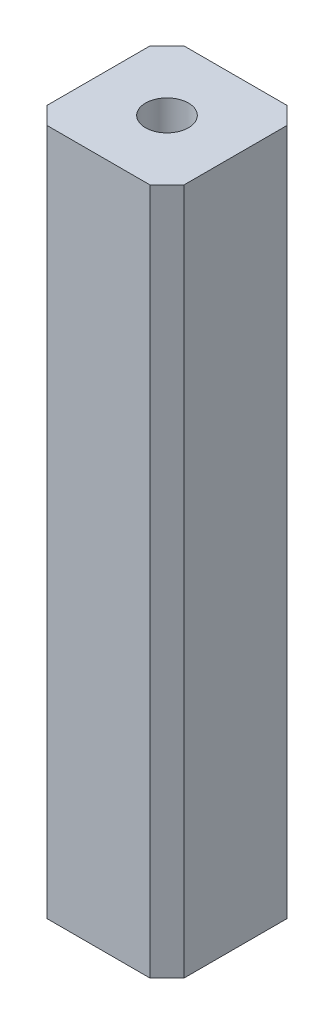
ISO-10303-21;
HEADER;
FILE_DESCRIPTION(('STEP AP214'),'2;1');
FILE_NAME('part.step','',(''),(''),'','','');
FILE_SCHEMA(('AUTOMOTIVE_DESIGN { 1 0 10303 214 1 1 1 1 }'));
ENDSEC;
DATA;
#1=APPLICATION_CONTEXT('core data for automotive mechanical design processes');
#2=APPLICATION_PROTOCOL_DEFINITION('international standard','automotive_design',2000,#1);
#3=PRODUCT_CONTEXT('',#1,'mechanical');
#4=PRODUCT('Part','Part','',(#3));
#5=PRODUCT_RELATED_PRODUCT_CATEGORY('part','',(#4));
#6=PRODUCT_DEFINITION_FORMATION('','',#4);
#7=PRODUCT_DEFINITION_CONTEXT('part definition',#1,'design');
#8=PRODUCT_DEFINITION('design','',#6,#7);
#9=PRODUCT_DEFINITION_SHAPE('','',#8);
#10=(LENGTH_UNIT() NAMED_UNIT(*) SI_UNIT(.MILLI.,.METRE.));
#11=(NAMED_UNIT(*) PLANE_ANGLE_UNIT() SI_UNIT($,.RADIAN.));
#12=(NAMED_UNIT(*) SI_UNIT($,.STERADIAN.) SOLID_ANGLE_UNIT());
#13=UNCERTAINTY_MEASURE_WITH_UNIT(LENGTH_MEASURE(1.E-05),#10,'distance_accuracy_value','');
#14=(GEOMETRIC_REPRESENTATION_CONTEXT(3) GLOBAL_UNCERTAINTY_ASSIGNED_CONTEXT((#13)) GLOBAL_UNIT_ASSIGNED_CONTEXT((#10,
#11,#12)) REPRESENTATION_CONTEXT('',''));
#15=CARTESIAN_POINT('',(0.,0.,0.));
#16=DIRECTION('',(0.,0.,1.));
#17=DIRECTION('',(1.,0.,0.));
#18=AXIS2_PLACEMENT_3D('',#15,#16,#17);
#19=CARTESIAN_POINT('',(0.,40.,0.));
#20=DIRECTION('',(0.,-1.,0.));
#21=DIRECTION('',(0.,0.,-1.));
#22=AXIS2_PLACEMENT_3D('',#19,#20,#21);
#23=PLANE('',#22);
#24=DIRECTION('',(0.,0.,-1.));
#25=VECTOR('',#24,1.);
#26=CARTESIAN_POINT('',(4.,40.,4.));
#27=LINE('',#26,#25);
#28=CARTESIAN_POINT('',(4.,40.,3.));
#29=VERTEX_POINT('',#28);
#30=CARTESIAN_POINT('',(4.,40.,-2.99999999999999));
#31=VERTEX_POINT('',#30);
#32=EDGE_CURVE('E143',#29,#31,#27,.T.);
#33=ORIENTED_EDGE('',*,*,#32,.T.);
#34=DIRECTION('',(0.707106781186546,0.,0.707106781186549));
#35=VECTOR('',#34,1.);
#36=CARTESIAN_POINT('',(3.,40.,-4.));
#37=LINE('',#36,#35);
#38=CARTESIAN_POINT('',(3.,40.,-4.));
#39=VERTEX_POINT('',#38);
#40=EDGE_CURVE('E158',#31,#39,#37,.F.);
#41=ORIENTED_EDGE('',*,*,#40,.T.);
#42=DIRECTION('',(-1.,0.,0.));
#43=VECTOR('',#42,1.);
#44=CARTESIAN_POINT('',(-4.,40.,-4.));
#45=LINE('',#44,#43);
#46=CARTESIAN_POINT('',(-2.99999999999999,40.,-4.));
#47=VERTEX_POINT('',#46);
#48=EDGE_CURVE('E125',#39,#47,#45,.T.);
#49=ORIENTED_EDGE('',*,*,#48,.T.);
#50=DIRECTION('',(0.707106781186549,0.,-0.707106781186546));
#51=VECTOR('',#50,1.);
#52=CARTESIAN_POINT('',(-4.,40.,-3.));
#53=LINE('',#52,#51);
#54=CARTESIAN_POINT('',(-4.,40.,-3.));
#55=VERTEX_POINT('',#54);
#56=EDGE_CURVE('E156',#47,#55,#53,.F.);
#57=ORIENTED_EDGE('',*,*,#56,.T.);
#58=DIRECTION('',(0.,0.,1.));
#59=VECTOR('',#58,1.);
#60=CARTESIAN_POINT('',(-4.,40.,4.));
#61=LINE('',#60,#59);
#62=CARTESIAN_POINT('',(-4.,40.,2.99999999999999));
#63=VERTEX_POINT('',#62);
#64=EDGE_CURVE('E169',#55,#63,#61,.T.);
#65=ORIENTED_EDGE('',*,*,#64,.T.);
#66=DIRECTION('',(-0.707106781186546,0.,-0.707106781186549));
#67=VECTOR('',#66,1.);
#68=CARTESIAN_POINT('',(-3.,40.,4.));
#69=LINE('',#68,#67);
#70=CARTESIAN_POINT('',(-3.,40.,4.));
#71=VERTEX_POINT('',#70);
#72=EDGE_CURVE('E60',#63,#71,#69,.F.);
#73=ORIENTED_EDGE('',*,*,#72,.T.);
#74=DIRECTION('',(1.,0.,0.));
#75=VECTOR('',#74,1.);
#76=CARTESIAN_POINT('',(-4.,40.,4.));
#77=LINE('',#76,#75);
#78=CARTESIAN_POINT('',(2.99999999999999,40.,4.));
#79=VERTEX_POINT('',#78);
#80=EDGE_CURVE('E144',#71,#79,#77,.T.);
#81=ORIENTED_EDGE('',*,*,#80,.T.);
#82=DIRECTION('',(-0.707106781186549,0.,0.707106781186546));
#83=VECTOR('',#82,1.);
#84=CARTESIAN_POINT('',(4.,40.,3.));
#85=LINE('',#84,#83);
#86=EDGE_CURVE('E153',#79,#29,#85,.F.);
#87=ORIENTED_EDGE('',*,*,#86,.T.);
#88=EDGE_LOOP('',(#33,#41,#49,#57,#65,#73,#81,#87));
#89=FACE_BOUND('',#88,.T.);
#90=CARTESIAN_POINT('',(0.,40.,0.));
#91=DIRECTION('',(0.,1.,0.));
#92=DIRECTION('',(0.,0.,1.));
#93=AXIS2_PLACEMENT_3D('',#90,#91,#92);
#94=CIRCLE('',#93,1.25);
#95=CARTESIAN_POINT('',(0.,40.,1.25));
#96=VERTEX_POINT('',#95);
#97=EDGE_CURVE('E138',#96,#96,#94,.T.);
#98=ORIENTED_EDGE('',*,*,#97,.F.);
#99=EDGE_LOOP('',(#98));
#100=FACE_BOUND('',#99,.T.);
#101=ADVANCED_FACE('F39',(#89,#100),#23,.F.);
#102=CARTESIAN_POINT('',(0.,0.,0.));
#103=DIRECTION('',(0.,-1.,0.));
#104=DIRECTION('',(0.,0.,-1.));
#105=AXIS2_PLACEMENT_3D('',#102,#103,#104);
#106=PLANE('',#105);
#107=DIRECTION('',(-1.,0.,0.));
#108=VECTOR('',#107,1.);
#109=CARTESIAN_POINT('',(-4.,0.,-4.));
#110=LINE('',#109,#108);
#111=CARTESIAN_POINT('',(3.,0.,-4.));
#112=VERTEX_POINT('',#111);
#113=CARTESIAN_POINT('',(-2.99999999999999,0.,-4.));
#114=VERTEX_POINT('',#113);
#115=EDGE_CURVE('E122',#112,#114,#110,.T.);
#116=ORIENTED_EDGE('',*,*,#115,.F.);
#117=DIRECTION('',(-0.707106781186546,0.,-0.707106781186549));
#118=VECTOR('',#117,1.);
#119=CARTESIAN_POINT('',(3.5,0.,-3.49999999999999));
#120=LINE('',#119,#118);
#121=CARTESIAN_POINT('',(4.,0.,-2.99999999999999));
#122=VERTEX_POINT('',#121);
#123=EDGE_CURVE('E105',#112,#122,#120,.F.);
#124=ORIENTED_EDGE('',*,*,#123,.T.);
#125=DIRECTION('',(0.,0.,-1.));
#126=VECTOR('',#125,1.);
#127=CARTESIAN_POINT('',(4.,0.,4.));
#128=LINE('',#127,#126);
#129=CARTESIAN_POINT('',(4.,0.,3.));
#130=VERTEX_POINT('',#129);
#131=EDGE_CURVE('E133',#130,#122,#128,.T.);
#132=ORIENTED_EDGE('',*,*,#131,.F.);
#133=DIRECTION('',(0.707106781186549,0.,-0.707106781186546));
#134=VECTOR('',#133,1.);
#135=CARTESIAN_POINT('',(3.49999999999999,0.,3.5));
#136=LINE('',#135,#134);
#137=CARTESIAN_POINT('',(2.99999999999999,0.,4.));
#138=VERTEX_POINT('',#137);
#139=EDGE_CURVE('E126',#130,#138,#136,.F.);
#140=ORIENTED_EDGE('',*,*,#139,.T.);
#141=DIRECTION('',(1.,0.,0.));
#142=VECTOR('',#141,1.);
#143=CARTESIAN_POINT('',(-4.,0.,4.));
#144=LINE('',#143,#142);
#145=CARTESIAN_POINT('',(-3.,0.,4.));
#146=VERTEX_POINT('',#145);
#147=EDGE_CURVE('E136',#146,#138,#144,.T.);
#148=ORIENTED_EDGE('',*,*,#147,.F.);
#149=DIRECTION('',(0.707106781186546,0.,0.707106781186549));
#150=VECTOR('',#149,1.);
#151=CARTESIAN_POINT('',(-3.5,0.,3.49999999999999));
#152=LINE('',#151,#150);
#153=CARTESIAN_POINT('',(-4.,0.,2.99999999999999));
#154=VERTEX_POINT('',#153);
#155=EDGE_CURVE('E147',#146,#154,#152,.F.);
#156=ORIENTED_EDGE('',*,*,#155,.T.);
#157=DIRECTION('',(0.,0.,1.));
#158=VECTOR('',#157,1.);
#159=CARTESIAN_POINT('',(-4.,0.,4.));
#160=LINE('',#159,#158);
#161=CARTESIAN_POINT('',(-4.,0.,-3.));
#162=VERTEX_POINT('',#161);
#163=EDGE_CURVE('E132',#162,#154,#160,.T.);
#164=ORIENTED_EDGE('',*,*,#163,.F.);
#165=DIRECTION('',(-0.707106781186549,0.,0.707106781186546));
#166=VECTOR('',#165,1.);
#167=CARTESIAN_POINT('',(-3.49999999999999,0.,-3.5));
#168=LINE('',#167,#166);
#169=EDGE_CURVE('E116',#162,#114,#168,.F.);
#170=ORIENTED_EDGE('',*,*,#169,.T.);
#171=EDGE_LOOP('',(#116,#124,#132,#140,#148,#156,#164,#170));
#172=FACE_BOUND('',#171,.T.);
#173=CARTESIAN_POINT('',(0.,0.,0.));
#174=DIRECTION('',(0.,1.,0.));
#175=DIRECTION('',(0.,0.,1.));
#176=AXIS2_PLACEMENT_3D('',#173,#174,#175);
#177=CIRCLE('',#176,1.25);
#178=CARTESIAN_POINT('',(0.,0.,1.25));
#179=VERTEX_POINT('',#178);
#180=EDGE_CURVE('E183',#179,#179,#177,.T.);
#181=ORIENTED_EDGE('',*,*,#180,.T.);
#182=EDGE_LOOP('',(#181));
#183=FACE_BOUND('',#182,.T.);
#184=ADVANCED_FACE('F129',(#172,#183),#106,.T.);
#185=CARTESIAN_POINT('',(4.,40.,4.));
#186=DIRECTION('',(-1.,0.,0.));
#187=DIRECTION('',(0.,0.,1.));
#188=AXIS2_PLACEMENT_3D('',#185,#186,#187);
#189=PLANE('',#188);
#190=ORIENTED_EDGE('',*,*,#131,.T.);
#191=DIRECTION('',(0.,1.,0.));
#192=VECTOR('',#191,1.);
#193=CARTESIAN_POINT('',(4.,40.,-2.99999999999999));
#194=LINE('',#193,#192);
#195=EDGE_CURVE('E110',#122,#31,#194,.T.);
#196=ORIENTED_EDGE('',*,*,#195,.T.);
#197=ORIENTED_EDGE('',*,*,#32,.F.);
#198=DIRECTION('',(0.,-1.,0.));
#199=VECTOR('',#198,1.);
#200=CARTESIAN_POINT('',(4.,40.,3.));
#201=LINE('',#200,#199);
#202=EDGE_CURVE('E115',#29,#130,#201,.T.);
#203=ORIENTED_EDGE('',*,*,#202,.T.);
#204=EDGE_LOOP('',(#190,#196,#197,#203));
#205=FACE_BOUND('',#204,.T.);
#206=ADVANCED_FACE('F197',(#205),#189,.F.);
#207=CARTESIAN_POINT('',(-4.,40.,-4.));
#208=DIRECTION('',(0.,0.,1.));
#209=DIRECTION('',(1.,0.,0.));
#210=AXIS2_PLACEMENT_3D('',#207,#208,#209);
#211=PLANE('',#210);
#212=ORIENTED_EDGE('',*,*,#48,.F.);
#213=DIRECTION('',(0.,-1.,0.));
#214=VECTOR('',#213,1.);
#215=CARTESIAN_POINT('',(3.,40.,-4.));
#216=LINE('',#215,#214);
#217=EDGE_CURVE('E109',#39,#112,#216,.T.);
#218=ORIENTED_EDGE('',*,*,#217,.T.);
#219=ORIENTED_EDGE('',*,*,#115,.T.);
#220=DIRECTION('',(0.,1.,0.));
#221=VECTOR('',#220,1.);
#222=CARTESIAN_POINT('',(-2.99999999999999,40.,-4.));
#223=LINE('',#222,#221);
#224=EDGE_CURVE('E127',#114,#47,#223,.T.);
#225=ORIENTED_EDGE('',*,*,#224,.T.);
#226=EDGE_LOOP('',(#212,#218,#219,#225));
#227=FACE_BOUND('',#226,.T.);
#228=ADVANCED_FACE('F121',(#227),#211,.F.);
#229=CARTESIAN_POINT('',(-4.,40.,4.));
#230=DIRECTION('',(1.,0.,0.));
#231=DIRECTION('',(0.,0.,-1.));
#232=AXIS2_PLACEMENT_3D('',#229,#230,#231);
#233=PLANE('',#232);
#234=ORIENTED_EDGE('',*,*,#64,.F.);
#235=DIRECTION('',(0.,-1.,0.));
#236=VECTOR('',#235,1.);
#237=CARTESIAN_POINT('',(-4.,40.,-3.));
#238=LINE('',#237,#236);
#239=EDGE_CURVE('E162',#55,#162,#238,.T.);
#240=ORIENTED_EDGE('',*,*,#239,.T.);
#241=ORIENTED_EDGE('',*,*,#163,.T.);
#242=DIRECTION('',(0.,1.,0.));
#243=VECTOR('',#242,1.);
#244=CARTESIAN_POINT('',(-4.,40.,2.99999999999999));
#245=LINE('',#244,#243);
#246=EDGE_CURVE('E160',#154,#63,#245,.T.);
#247=ORIENTED_EDGE('',*,*,#246,.T.);
#248=EDGE_LOOP('',(#234,#240,#241,#247));
#249=FACE_BOUND('',#248,.T.);
#250=ADVANCED_FACE('F167',(#249),#233,.F.);
#251=CARTESIAN_POINT('',(-4.,40.,4.));
#252=DIRECTION('',(0.,0.,-1.));
#253=DIRECTION('',(-1.,0.,0.));
#254=AXIS2_PLACEMENT_3D('',#251,#252,#253);
#255=PLANE('',#254);
#256=ORIENTED_EDGE('',*,*,#80,.F.);
#257=DIRECTION('',(0.,-1.,0.));
#258=VECTOR('',#257,1.);
#259=CARTESIAN_POINT('',(-3.,40.,4.));
#260=LINE('',#259,#258);
#261=EDGE_CURVE('E11',#71,#146,#260,.T.);
#262=ORIENTED_EDGE('',*,*,#261,.T.);
#263=ORIENTED_EDGE('',*,*,#147,.T.);
#264=DIRECTION('',(0.,1.,0.));
#265=VECTOR('',#264,1.);
#266=CARTESIAN_POINT('',(2.99999999999999,40.,4.));
#267=LINE('',#266,#265);
#268=EDGE_CURVE('E47',#138,#79,#267,.T.);
#269=ORIENTED_EDGE('',*,*,#268,.T.);
#270=EDGE_LOOP('',(#256,#262,#263,#269));
#271=FACE_BOUND('',#270,.T.);
#272=ADVANCED_FACE('F176',(#271),#255,.F.);
#273=CARTESIAN_POINT('',(0.,40.,0.));
#274=DIRECTION('',(0.,-1.,0.));
#275=DIRECTION('',(0.,0.,-1.));
#276=AXIS2_PLACEMENT_3D('',#273,#274,#275);
#277=CYLINDRICAL_SURFACE('',#276,1.25);
#278=ORIENTED_EDGE('',*,*,#97,.T.);
#279=EDGE_LOOP('',(#278));
#280=FACE_BOUND('',#279,.T.);
#281=ORIENTED_EDGE('',*,*,#180,.F.);
#282=EDGE_LOOP('',(#281));
#283=FACE_BOUND('',#282,.T.);
#284=ADVANCED_FACE('F189',(#280,#283),#277,.F.);
#285=CARTESIAN_POINT('',(3.,40.,-4.));
#286=DIRECTION('',(-0.707106781186549,0.,0.707106781186546));
#287=DIRECTION('',(0.,-1.,0.));
#288=AXIS2_PLACEMENT_3D('',#285,#286,#287);
#289=PLANE('',#288);
#290=ORIENTED_EDGE('',*,*,#40,.F.);
#291=ORIENTED_EDGE('',*,*,#195,.F.);
#292=ORIENTED_EDGE('',*,*,#123,.F.);
#293=ORIENTED_EDGE('',*,*,#217,.F.);
#294=EDGE_LOOP('',(#290,#291,#292,#293));
#295=FACE_BOUND('',#294,.T.);
#296=ADVANCED_FACE('F108',(#295),#289,.F.);
#297=CARTESIAN_POINT('',(-4.,40.,-3.));
#298=DIRECTION('',(0.707106781186546,0.,0.707106781186549));
#299=DIRECTION('',(0.,-1.,0.));
#300=AXIS2_PLACEMENT_3D('',#297,#298,#299);
#301=PLANE('',#300);
#302=ORIENTED_EDGE('',*,*,#56,.F.);
#303=ORIENTED_EDGE('',*,*,#224,.F.);
#304=ORIENTED_EDGE('',*,*,#169,.F.);
#305=ORIENTED_EDGE('',*,*,#239,.F.);
#306=EDGE_LOOP('',(#302,#303,#304,#305));
#307=FACE_BOUND('',#306,.T.);
#308=ADVANCED_FACE('F212',(#307),#301,.F.);
#309=CARTESIAN_POINT('',(-3.,40.,4.));
#310=DIRECTION('',(0.707106781186549,0.,-0.707106781186546));
#311=DIRECTION('',(0.,-1.,0.));
#312=AXIS2_PLACEMENT_3D('',#309,#310,#311);
#313=PLANE('',#312);
#314=ORIENTED_EDGE('',*,*,#72,.F.);
#315=ORIENTED_EDGE('',*,*,#246,.F.);
#316=ORIENTED_EDGE('',*,*,#155,.F.);
#317=ORIENTED_EDGE('',*,*,#261,.F.);
#318=EDGE_LOOP('',(#314,#315,#316,#317));
#319=FACE_BOUND('',#318,.T.);
#320=ADVANCED_FACE('F175',(#319),#313,.F.);
#321=CARTESIAN_POINT('',(4.,40.,3.));
#322=DIRECTION('',(-0.707106781186546,0.,-0.707106781186549));
#323=DIRECTION('',(0.,-1.,0.));
#324=AXIS2_PLACEMENT_3D('',#321,#322,#323);
#325=PLANE('',#324);
#326=ORIENTED_EDGE('',*,*,#86,.F.);
#327=ORIENTED_EDGE('',*,*,#268,.F.);
#328=ORIENTED_EDGE('',*,*,#139,.F.);
#329=ORIENTED_EDGE('',*,*,#202,.F.);
#330=EDGE_LOOP('',(#326,#327,#328,#329));
#331=FACE_BOUND('',#330,.T.);
#332=ADVANCED_FACE('F41',(#331),#325,.F.);
#333=CLOSED_SHELL('',(#101,#184,#206,#228,#250,#272,#284,#296,#308,#320,#332));
#334=MANIFOLD_SOLID_BREP('B2',#333);
#335=ADVANCED_BREP_SHAPE_REPRESENTATION('',(#18,#334),#14);
#336=SHAPE_DEFINITION_REPRESENTATION(#9,#335);
ENDSEC;
END-ISO-10303-21;
